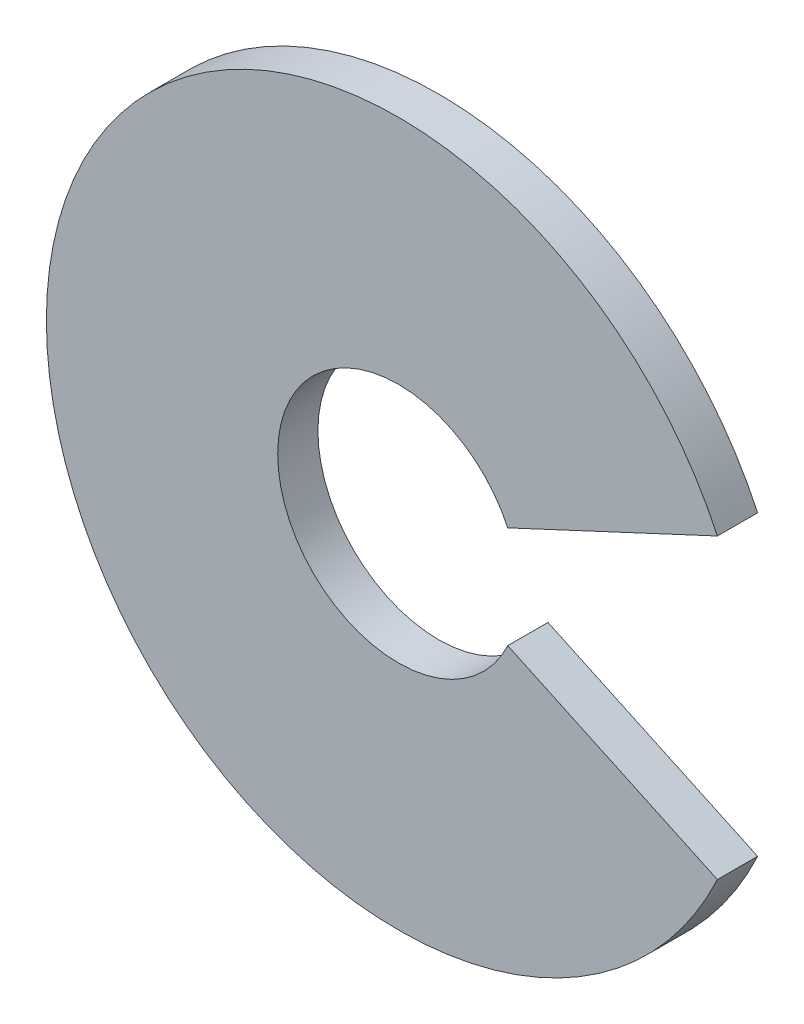
ISO-10303-21;
HEADER;
FILE_DESCRIPTION(('STEP AP214'),'2;1');
FILE_NAME('part.step','',(''),(''),'','','');
FILE_SCHEMA(('AUTOMOTIVE_DESIGN { 1 0 10303 214 1 1 1 1 }'));
ENDSEC;
DATA;
#1=APPLICATION_CONTEXT('core data for automotive mechanical design processes');
#2=APPLICATION_PROTOCOL_DEFINITION('international standard','automotive_design',2000,#1);
#3=PRODUCT_CONTEXT('',#1,'mechanical');
#4=PRODUCT('Part','Part','',(#3));
#5=PRODUCT_RELATED_PRODUCT_CATEGORY('part','',(#4));
#6=PRODUCT_DEFINITION_FORMATION('','',#4);
#7=PRODUCT_DEFINITION_CONTEXT('part definition',#1,'design');
#8=PRODUCT_DEFINITION('design','',#6,#7);
#9=PRODUCT_DEFINITION_SHAPE('','',#8);
#10=(LENGTH_UNIT() NAMED_UNIT(*) SI_UNIT(.MILLI.,.METRE.));
#11=(NAMED_UNIT(*) PLANE_ANGLE_UNIT() SI_UNIT($,.RADIAN.));
#12=(NAMED_UNIT(*) SI_UNIT($,.STERADIAN.) SOLID_ANGLE_UNIT());
#13=UNCERTAINTY_MEASURE_WITH_UNIT(LENGTH_MEASURE(1.E-05),#10,'distance_accuracy_value','');
#14=(GEOMETRIC_REPRESENTATION_CONTEXT(3) GLOBAL_UNCERTAINTY_ASSIGNED_CONTEXT((#13)) GLOBAL_UNIT_ASSIGNED_CONTEXT((#10,
#11,#12)) REPRESENTATION_CONTEXT('',''));
#15=CARTESIAN_POINT('',(0.,0.,0.));
#16=DIRECTION('',(0.,0.,1.));
#17=DIRECTION('',(1.,0.,0.));
#18=AXIS2_PLACEMENT_3D('',#15,#16,#17);
#19=CARTESIAN_POINT('',(0.,0.,0.2));
#20=DIRECTION('',(0.,0.,-1.));
#21=DIRECTION('',(-1.,0.,0.));
#22=AXIS2_PLACEMENT_3D('',#19,#20,#21);
#23=CYLINDRICAL_SURFACE('',#22,3.5);
#24=CARTESIAN_POINT('',(0.,0.,-0.2));
#25=DIRECTION('',(0.,0.,1.));
#26=DIRECTION('',(1.,0.,0.));
#27=AXIS2_PLACEMENT_3D('',#24,#25,#26);
#28=CIRCLE('',#27,3.5);
#29=CARTESIAN_POINT('',(3.17207725462827,1.47916391609245,-0.2));
#30=VERTEX_POINT('',#29);
#31=CARTESIAN_POINT('',(3.17207725462827,-1.47916391609245,-0.2));
#32=VERTEX_POINT('',#31);
#33=EDGE_CURVE('E112',#30,#32,#28,.T.);
#34=ORIENTED_EDGE('',*,*,#33,.T.);
#35=DIRECTION('',(0.,0.,-1.));
#36=VECTOR('',#35,1.);
#37=CARTESIAN_POINT('',(3.17207725462827,-1.47916391609245,0.2));
#38=LINE('',#37,#36);
#39=CARTESIAN_POINT('',(3.17207725462827,-1.47916391609245,0.2));
#40=VERTEX_POINT('',#39);
#41=EDGE_CURVE('E11',#40,#32,#38,.T.);
#42=ORIENTED_EDGE('',*,*,#41,.F.);
#43=CARTESIAN_POINT('',(0.,0.,0.2));
#44=DIRECTION('',(0.,0.,1.));
#45=DIRECTION('',(1.,0.,0.));
#46=AXIS2_PLACEMENT_3D('',#43,#44,#45);
#47=CIRCLE('',#46,3.5);
#48=CARTESIAN_POINT('',(3.17207725462827,1.47916391609245,0.2));
#49=VERTEX_POINT('',#48);
#50=EDGE_CURVE('E97',#49,#40,#47,.T.);
#51=ORIENTED_EDGE('',*,*,#50,.F.);
#52=DIRECTION('',(0.,0.,-1.));
#53=VECTOR('',#52,1.);
#54=CARTESIAN_POINT('',(3.17207725462827,1.47916391609245,0.2));
#55=LINE('',#54,#53);
#56=EDGE_CURVE('E110',#49,#30,#55,.T.);
#57=ORIENTED_EDGE('',*,*,#56,.T.);
#58=EDGE_LOOP('',(#34,#42,#51,#57));
#59=FACE_BOUND('',#58,.T.);
#60=ADVANCED_FACE('F50',(#59),#23,.T.);
#61=CARTESIAN_POINT('',(3.17207725462827,-1.47916391609245,0.2));
#62=DIRECTION('',(-0.422618261740699,-0.90630778703665,0.));
#63=DIRECTION('',(0.90630778703665,-0.4226182617407,0.));
#64=AXIS2_PLACEMENT_3D('',#61,#62,#63);
#65=PLANE('',#64);
#66=DIRECTION('',(-0.90630778703665,0.422618261740699,0.));
#67=VECTOR('',#66,1.);
#68=CARTESIAN_POINT('',(3.17207725462827,-1.47916391609245,-0.2));
#69=LINE('',#68,#67);
#70=CARTESIAN_POINT('',(1.08756934444398,-0.507141914088839,-0.2));
#71=VERTEX_POINT('',#70);
#72=EDGE_CURVE('E103',#32,#71,#69,.T.);
#73=ORIENTED_EDGE('',*,*,#72,.T.);
#74=DIRECTION('',(0.,0.,-1.));
#75=VECTOR('',#74,1.);
#76=CARTESIAN_POINT('',(1.08756934444398,-0.507141914088839,0.2));
#77=LINE('',#76,#75);
#78=CARTESIAN_POINT('',(1.08756934444398,-0.507141914088839,0.2));
#79=VERTEX_POINT('',#78);
#80=EDGE_CURVE('E57',#79,#71,#77,.T.);
#81=ORIENTED_EDGE('',*,*,#80,.F.);
#82=DIRECTION('',(-0.90630778703665,0.422618261740699,0.));
#83=VECTOR('',#82,1.);
#84=CARTESIAN_POINT('',(3.17207725462827,-1.47916391609245,0.2));
#85=LINE('',#84,#83);
#86=EDGE_CURVE('E94',#40,#79,#85,.T.);
#87=ORIENTED_EDGE('',*,*,#86,.F.);
#88=ORIENTED_EDGE('',*,*,#41,.T.);
#89=EDGE_LOOP('',(#73,#81,#87,#88));
#90=FACE_BOUND('',#89,.T.);
#91=ADVANCED_FACE('F105',(#90),#65,.F.);
#92=CARTESIAN_POINT('',(0.,0.,0.2));
#93=DIRECTION('',(0.,0.,-1.));
#94=DIRECTION('',(-1.,0.,0.));
#95=AXIS2_PLACEMENT_3D('',#92,#93,#94);
#96=CYLINDRICAL_SURFACE('',#95,1.2);
#97=CARTESIAN_POINT('',(0.,0.,-0.2));
#98=DIRECTION('',(0.,0.,-1.));
#99=DIRECTION('',(-1.,0.,0.));
#100=AXIS2_PLACEMENT_3D('',#97,#98,#99);
#101=CIRCLE('',#100,1.2);
#102=CARTESIAN_POINT('',(1.08756934444398,0.507141914088839,-0.2));
#103=VERTEX_POINT('',#102);
#104=EDGE_CURVE('E82',#71,#103,#101,.T.);
#105=ORIENTED_EDGE('',*,*,#104,.T.);
#106=DIRECTION('',(0.,0.,-1.));
#107=VECTOR('',#106,1.);
#108=CARTESIAN_POINT('',(1.08756934444398,0.507141914088839,0.2));
#109=LINE('',#108,#107);
#110=CARTESIAN_POINT('',(1.08756934444398,0.507141914088839,0.2));
#111=VERTEX_POINT('',#110);
#112=EDGE_CURVE('E102',#111,#103,#109,.T.);
#113=ORIENTED_EDGE('',*,*,#112,.F.);
#114=CARTESIAN_POINT('',(0.,0.,0.2));
#115=DIRECTION('',(0.,0.,-1.));
#116=DIRECTION('',(-1.,0.,0.));
#117=AXIS2_PLACEMENT_3D('',#114,#115,#116);
#118=CIRCLE('',#117,1.2);
#119=EDGE_CURVE('E100',#79,#111,#118,.T.);
#120=ORIENTED_EDGE('',*,*,#119,.F.);
#121=ORIENTED_EDGE('',*,*,#80,.T.);
#122=EDGE_LOOP('',(#105,#113,#120,#121));
#123=FACE_BOUND('',#122,.T.);
#124=ADVANCED_FACE('F104',(#123),#96,.F.);
#125=CARTESIAN_POINT('',(1.08756934444398,0.507141914088839,0.2));
#126=DIRECTION('',(-0.422618261740699,0.90630778703665,0.));
#127=DIRECTION('',(-0.90630778703665,-0.4226182617407,0.));
#128=AXIS2_PLACEMENT_3D('',#125,#126,#127);
#129=PLANE('',#128);
#130=DIRECTION('',(0.90630778703665,0.422618261740699,0.));
#131=VECTOR('',#130,1.);
#132=CARTESIAN_POINT('',(1.08756934444398,0.507141914088839,-0.2));
#133=LINE('',#132,#131);
#134=EDGE_CURVE('E87',#103,#30,#133,.T.);
#135=ORIENTED_EDGE('',*,*,#134,.T.);
#136=ORIENTED_EDGE('',*,*,#56,.F.);
#137=DIRECTION('',(0.90630778703665,0.422618261740699,0.));
#138=VECTOR('',#137,1.);
#139=CARTESIAN_POINT('',(1.08756934444398,0.507141914088839,0.2));
#140=LINE('',#139,#138);
#141=EDGE_CURVE('E63',#111,#49,#140,.T.);
#142=ORIENTED_EDGE('',*,*,#141,.F.);
#143=ORIENTED_EDGE('',*,*,#112,.T.);
#144=EDGE_LOOP('',(#135,#136,#142,#143));
#145=FACE_BOUND('',#144,.T.);
#146=ADVANCED_FACE('F119',(#145),#129,.F.);
#147=CARTESIAN_POINT('',(0.,0.,0.2));
#148=DIRECTION('',(0.,0.,1.));
#149=DIRECTION('',(1.,0.,0.));
#150=AXIS2_PLACEMENT_3D('',#147,#148,#149);
#151=PLANE('',#150);
#152=ORIENTED_EDGE('',*,*,#50,.T.);
#153=ORIENTED_EDGE('',*,*,#86,.T.);
#154=ORIENTED_EDGE('',*,*,#119,.T.);
#155=ORIENTED_EDGE('',*,*,#141,.T.);
#156=EDGE_LOOP('',(#152,#153,#154,#155));
#157=FACE_BOUND('',#156,.T.);
#158=ADVANCED_FACE('F92',(#157),#151,.T.);
#159=CARTESIAN_POINT('',(0.,0.,-0.2));
#160=DIRECTION('',(0.,0.,1.));
#161=DIRECTION('',(1.,0.,0.));
#162=AXIS2_PLACEMENT_3D('',#159,#160,#161);
#163=PLANE('',#162);
#164=ORIENTED_EDGE('',*,*,#33,.F.);
#165=ORIENTED_EDGE('',*,*,#134,.F.);
#166=ORIENTED_EDGE('',*,*,#104,.F.);
#167=ORIENTED_EDGE('',*,*,#72,.F.);
#168=EDGE_LOOP('',(#164,#165,#166,#167));
#169=FACE_BOUND('',#168,.T.);
#170=ADVANCED_FACE('F122',(#169),#163,.F.);
#171=CLOSED_SHELL('',(#60,#91,#124,#146,#158,#170));
#172=MANIFOLD_SOLID_BREP('B2',#171);
#173=ADVANCED_BREP_SHAPE_REPRESENTATION('',(#18,#172),#14);
#174=SHAPE_DEFINITION_REPRESENTATION(#9,#173);
ENDSEC;
END-ISO-10303-21;
